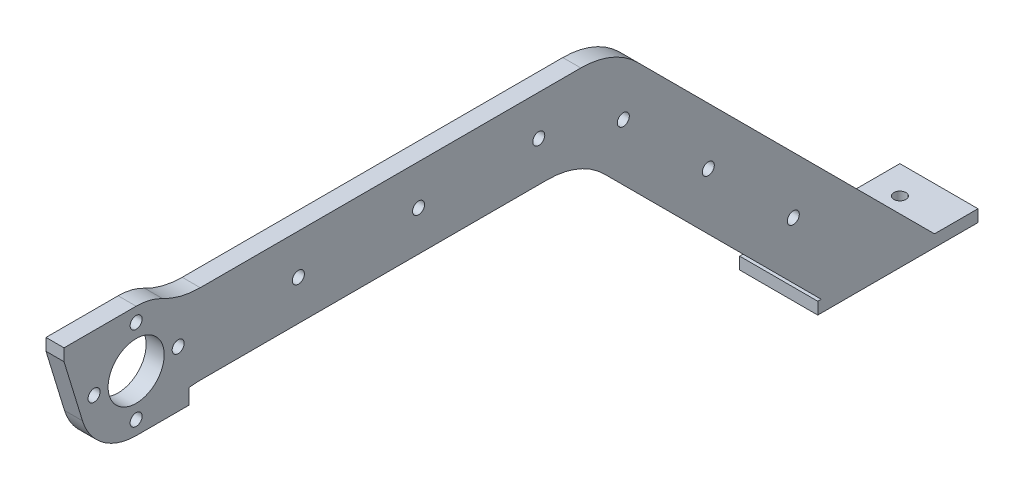
ISO-10303-21;
HEADER;
FILE_DESCRIPTION(('STEP AP214'),'2;1');
FILE_NAME('part.step','',(''),(''),'','','');
FILE_SCHEMA(('AUTOMOTIVE_DESIGN { 1 0 10303 214 1 1 1 1 }'));
ENDSEC;
DATA;
#1=APPLICATION_CONTEXT('core data for automotive mechanical design processes');
#2=APPLICATION_PROTOCOL_DEFINITION('international standard','automotive_design',2000,#1);
#3=PRODUCT_CONTEXT('',#1,'mechanical');
#4=PRODUCT('Part','Part','',(#3));
#5=PRODUCT_RELATED_PRODUCT_CATEGORY('part','',(#4));
#6=PRODUCT_DEFINITION_FORMATION('','',#4);
#7=PRODUCT_DEFINITION_CONTEXT('part definition',#1,'design');
#8=PRODUCT_DEFINITION('design','',#6,#7);
#9=PRODUCT_DEFINITION_SHAPE('','',#8);
#10=(LENGTH_UNIT() NAMED_UNIT(*) SI_UNIT(.MILLI.,.METRE.));
#11=(NAMED_UNIT(*) PLANE_ANGLE_UNIT() SI_UNIT($,.RADIAN.));
#12=(NAMED_UNIT(*) SI_UNIT($,.STERADIAN.) SOLID_ANGLE_UNIT());
#13=UNCERTAINTY_MEASURE_WITH_UNIT(LENGTH_MEASURE(1.E-05),#10,'distance_accuracy_value','');
#14=(GEOMETRIC_REPRESENTATION_CONTEXT(3) GLOBAL_UNCERTAINTY_ASSIGNED_CONTEXT((#13)) GLOBAL_UNIT_ASSIGNED_CONTEXT((#10,
#11,#12)) REPRESENTATION_CONTEXT('',''));
#15=CARTESIAN_POINT('',(0.,0.,0.));
#16=DIRECTION('',(0.,0.,1.));
#17=DIRECTION('',(1.,0.,0.));
#18=AXIS2_PLACEMENT_3D('',#15,#16,#17);
#19=CARTESIAN_POINT('',(2.25,-30.,-16.));
#20=DIRECTION('',(-1.,0.,0.));
#21=DIRECTION('',(0.,0.,1.));
#22=AXIS2_PLACEMENT_3D('',#19,#20,#21);
#23=CYLINDRICAL_SURFACE('',#22,20.);
#24=CARTESIAN_POINT('',(-2.25,-30.,-16.));
#25=DIRECTION('',(1.,0.,0.));
#26=DIRECTION('',(0.,0.,-1.));
#27=AXIS2_PLACEMENT_3D('',#24,#25,#26);
#28=CIRCLE('',#27,20.);
#29=CARTESIAN_POINT('',(-2.25,-10.,-16.));
#30=VERTEX_POINT('',#29);
#31=CARTESIAN_POINT('',(-2.25,-10.1935572336007,-13.2242433569657));
#32=VERTEX_POINT('',#31);
#33=EDGE_CURVE('E234',#30,#32,#28,.T.);
#34=ORIENTED_EDGE('',*,*,#33,.F.);
#35=DIRECTION('',(-1.,0.,0.));
#36=VECTOR('',#35,1.);
#37=CARTESIAN_POINT('',(2.25,-10.,-16.));
#38=LINE('',#37,#36);
#39=CARTESIAN_POINT('',(2.25,-10.,-16.));
#40=VERTEX_POINT('',#39);
#41=EDGE_CURVE('E11',#40,#30,#38,.T.);
#42=ORIENTED_EDGE('',*,*,#41,.F.);
#43=CARTESIAN_POINT('',(2.25,-30.,-16.));
#44=DIRECTION('',(1.,0.,0.));
#45=DIRECTION('',(0.,0.,-1.));
#46=AXIS2_PLACEMENT_3D('',#43,#44,#45);
#47=CIRCLE('',#46,20.);
#48=CARTESIAN_POINT('',(2.25,-10.1935572336007,-13.2242433569657));
#49=VERTEX_POINT('',#48);
#50=EDGE_CURVE('E326',#40,#49,#47,.T.);
#51=ORIENTED_EDGE('',*,*,#50,.T.);
#52=DIRECTION('',(-1.,0.,0.));
#53=VECTOR('',#52,1.);
#54=CARTESIAN_POINT('',(2.25,-10.1935572336007,-13.2242433569657));
#55=LINE('',#54,#53);
#56=EDGE_CURVE('E115',#49,#32,#55,.T.);
#57=ORIENTED_EDGE('',*,*,#56,.T.);
#58=EDGE_LOOP('',(#34,#42,#51,#57));
#59=FACE_BOUND('',#58,.T.);
#60=ADVANCED_FACE('F41',(#59),#23,.F.);
#61=CARTESIAN_POINT('',(2.25,-10.,0.));
#62=DIRECTION('',(0.,1.,0.));
#63=DIRECTION('',(0.,0.,1.));
#64=AXIS2_PLACEMENT_3D('',#61,#62,#63);
#65=PLANE('',#64);
#66=DIRECTION('',(0.,0.,-1.));
#67=VECTOR('',#66,1.);
#68=CARTESIAN_POINT('',(-2.25,-10.,0.));
#69=LINE('',#68,#67);
#70=CARTESIAN_POINT('',(-2.25,-10.,-102.736907966864));
#71=VERTEX_POINT('',#70);
#72=EDGE_CURVE('E238',#30,#71,#69,.T.);
#73=ORIENTED_EDGE('',*,*,#72,.T.);
#74=DIRECTION('',(-1.,0.,0.));
#75=VECTOR('',#74,1.);
#76=CARTESIAN_POINT('',(2.25,-10.,-102.736907966864));
#77=LINE('',#76,#75);
#78=CARTESIAN_POINT('',(2.25,-10.,-102.736907966864));
#79=VERTEX_POINT('',#78);
#80=EDGE_CURVE('E50',#79,#71,#77,.T.);
#81=ORIENTED_EDGE('',*,*,#80,.F.);
#82=DIRECTION('',(0.,0.,-1.));
#83=VECTOR('',#82,1.);
#84=CARTESIAN_POINT('',(2.25,-10.,0.));
#85=LINE('',#84,#83);
#86=EDGE_CURVE('E447',#40,#79,#85,.T.);
#87=ORIENTED_EDGE('',*,*,#86,.F.);
#88=ORIENTED_EDGE('',*,*,#41,.T.);
#89=EDGE_LOOP('',(#73,#81,#87,#88));
#90=FACE_BOUND('',#89,.T.);
#91=ADVANCED_FACE('F537',(#90),#65,.F.);
#92=CARTESIAN_POINT('',(2.25,-29.999988774128,-102.715717526666));
#93=DIRECTION('',(-1.,0.,0.));
#94=DIRECTION('',(0.,0.,1.));
#95=AXIS2_PLACEMENT_3D('',#92,#93,#94);
#96=CYLINDRICAL_SURFACE('',#95,20.);
#97=CARTESIAN_POINT('',(-2.25,-29.999988774128,-102.715717526666));
#98=DIRECTION('',(1.,0.,0.));
#99=DIRECTION('',(0.,0.,-1.));
#100=AXIS2_PLACEMENT_3D('',#97,#98,#99);
#101=CIRCLE('',#100,20.);
#102=CARTESIAN_POINT('',(-2.25,-15.857853150397,-116.857853150397));
#103=VERTEX_POINT('',#102);
#104=EDGE_CURVE('E242',#71,#103,#101,.F.);
#105=ORIENTED_EDGE('',*,*,#104,.T.);
#106=DIRECTION('',(-1.,0.,0.));
#107=VECTOR('',#106,1.);
#108=CARTESIAN_POINT('',(2.25,-15.857853150397,-116.857853150397));
#109=LINE('',#108,#107);
#110=CARTESIAN_POINT('',(2.25,-15.857853150397,-116.857853150397));
#111=VERTEX_POINT('',#110);
#112=EDGE_CURVE('E368',#111,#103,#109,.T.);
#113=ORIENTED_EDGE('',*,*,#112,.F.);
#114=CARTESIAN_POINT('',(2.25,-29.999988774128,-102.715717526666));
#115=DIRECTION('',(1.,0.,0.));
#116=DIRECTION('',(0.,0.,-1.));
#117=AXIS2_PLACEMENT_3D('',#114,#115,#116);
#118=CIRCLE('',#117,20.);
#119=EDGE_CURVE('E379',#79,#111,#118,.F.);
#120=ORIENTED_EDGE('',*,*,#119,.F.);
#121=ORIENTED_EDGE('',*,*,#80,.T.);
#122=EDGE_LOOP('',(#105,#113,#120,#121));
#123=FACE_BOUND('',#122,.T.);
#124=ADVANCED_FACE('F377',(#123),#96,.F.);
#125=CARTESIAN_POINT('',(2.25,50.5000000000001,-50.5000000000003));
#126=DIRECTION('',(0.,0.707106781186546,-0.707106781186549));
#127=DIRECTION('',(0.,0.707106781186549,0.707106781186546));
#128=AXIS2_PLACEMENT_3D('',#125,#126,#127);
#129=PLANE('',#128);
#130=DIRECTION('',(0.,-0.707106781186549,-0.707106781186546));
#131=VECTOR('',#130,1.);
#132=CARTESIAN_POINT('',(-2.25,50.5000000000001,-50.5000000000003));
#133=LINE('',#132,#131);
#134=CARTESIAN_POINT('',(-2.25,-70.,-171.));
#135=VERTEX_POINT('',#134);
#136=EDGE_CURVE('E245',#103,#135,#133,.T.);
#137=ORIENTED_EDGE('',*,*,#136,.T.);
#138=DIRECTION('',(-1.,0.,0.));
#139=VECTOR('',#138,1.);
#140=CARTESIAN_POINT('',(2.25,-70.,-171.));
#141=LINE('',#140,#139);
#142=CARTESIAN_POINT('',(2.25,-70.,-171.));
#143=VERTEX_POINT('',#142);
#144=EDGE_CURVE('E364',#143,#135,#141,.T.);
#145=ORIENTED_EDGE('',*,*,#144,.F.);
#146=DIRECTION('',(0.,-0.707106781186549,-0.707106781186546));
#147=VECTOR('',#146,1.);
#148=CARTESIAN_POINT('',(2.25,50.5000000000001,-50.5000000000003));
#149=LINE('',#148,#147);
#150=EDGE_CURVE('E452',#111,#143,#149,.T.);
#151=ORIENTED_EDGE('',*,*,#150,.F.);
#152=ORIENTED_EDGE('',*,*,#112,.T.);
#153=EDGE_LOOP('',(#137,#145,#151,#152));
#154=FACE_BOUND('',#153,.T.);
#155=ADVANCED_FACE('F390',(#154),#129,.F.);
#156=CARTESIAN_POINT('',(2.25,64.642135623731,-64.6421356237312));
#157=DIRECTION('',(0.,-0.707106781186546,0.707106781186548));
#158=DIRECTION('',(0.,-0.707106781186549,-0.707106781186546));
#159=AXIS2_PLACEMENT_3D('',#156,#157,#158);
#160=PLANE('',#159);
#161=DIRECTION('',(0.,0.707106781186549,0.707106781186546));
#162=VECTOR('',#161,1.);
#163=CARTESIAN_POINT('',(-2.25,64.642135623731,-64.6421356237312));
#164=LINE('',#163,#162);
#165=CARTESIAN_POINT('',(-2.25,-70.,-199.284271247462));
#166=VERTEX_POINT('',#165);
#167=CARTESIAN_POINT('',(-2.25,4.14213562373093,-125.142135623731));
#168=VERTEX_POINT('',#167);
#169=EDGE_CURVE('E253',#166,#168,#164,.T.);
#170=ORIENTED_EDGE('',*,*,#169,.T.);
#171=DIRECTION('',(-1.,0.,0.));
#172=VECTOR('',#171,1.);
#173=CARTESIAN_POINT('',(2.25,4.14213562373093,-125.142135623731));
#174=LINE('',#173,#172);
#175=CARTESIAN_POINT('',(2.25,4.14213562373093,-125.142135623731));
#176=VERTEX_POINT('',#175);
#177=EDGE_CURVE('E357',#176,#168,#174,.T.);
#178=ORIENTED_EDGE('',*,*,#177,.F.);
#179=DIRECTION('',(0.,0.707106781186549,0.707106781186546));
#180=VECTOR('',#179,1.);
#181=CARTESIAN_POINT('',(2.25,64.642135623731,-64.6421356237312));
#182=LINE('',#181,#180);
#183=CARTESIAN_POINT('',(2.25,-70.,-199.284271247462));
#184=VERTEX_POINT('',#183);
#185=EDGE_CURVE('E455',#184,#176,#182,.T.);
#186=ORIENTED_EDGE('',*,*,#185,.F.);
#187=DIRECTION('',(-1.,0.,0.));
#188=VECTOR('',#187,1.);
#189=CARTESIAN_POINT('',(2.25,-70.,-199.284271247462));
#190=LINE('',#189,#188);
#191=EDGE_CURVE('E361',#184,#166,#190,.T.);
#192=ORIENTED_EDGE('',*,*,#191,.T.);
#193=EDGE_LOOP('',(#170,#178,#186,#192));
#194=FACE_BOUND('',#193,.T.);
#195=ADVANCED_FACE('F583',(#194),#160,.F.);
#196=CARTESIAN_POINT('',(2.25,-10.,-111.));
#197=DIRECTION('',(-1.,0.,0.));
#198=DIRECTION('',(0.,0.,1.));
#199=AXIS2_PLACEMENT_3D('',#196,#197,#198);
#200=CYLINDRICAL_SURFACE('',#199,20.);
#201=CARTESIAN_POINT('',(-2.25,-10.,-111.));
#202=DIRECTION('',(1.,0.,0.));
#203=DIRECTION('',(0.,0.,-1.));
#204=AXIS2_PLACEMENT_3D('',#201,#202,#203);
#205=CIRCLE('',#204,20.);
#206=CARTESIAN_POINT('',(-2.25,10.,-111.));
#207=VERTEX_POINT('',#206);
#208=EDGE_CURVE('E256',#168,#207,#205,.T.);
#209=ORIENTED_EDGE('',*,*,#208,.T.);
#210=DIRECTION('',(-1.,0.,0.));
#211=VECTOR('',#210,1.);
#212=CARTESIAN_POINT('',(2.25,10.,-111.));
#213=LINE('',#212,#211);
#214=CARTESIAN_POINT('',(2.25,10.,-111.));
#215=VERTEX_POINT('',#214);
#216=EDGE_CURVE('E353',#215,#207,#213,.T.);
#217=ORIENTED_EDGE('',*,*,#216,.F.);
#218=CARTESIAN_POINT('',(2.25,-10.,-111.));
#219=DIRECTION('',(1.,0.,0.));
#220=DIRECTION('',(0.,0.,-1.));
#221=AXIS2_PLACEMENT_3D('',#218,#219,#220);
#222=CIRCLE('',#221,20.);
#223=EDGE_CURVE('E458',#176,#215,#222,.T.);
#224=ORIENTED_EDGE('',*,*,#223,.F.);
#225=ORIENTED_EDGE('',*,*,#177,.T.);
#226=EDGE_LOOP('',(#209,#217,#224,#225));
#227=FACE_BOUND('',#226,.T.);
#228=ADVANCED_FACE('F579',(#227),#200,.T.);
#229=CARTESIAN_POINT('',(2.25,10.,0.));
#230=DIRECTION('',(0.,-1.,0.));
#231=DIRECTION('',(0.,0.,-1.));
#232=AXIS2_PLACEMENT_3D('',#229,#230,#231);
#233=PLANE('',#232);
#234=DIRECTION('',(0.,0.,1.));
#235=VECTOR('',#234,1.);
#236=CARTESIAN_POINT('',(-2.25,10.,0.));
#237=LINE('',#236,#235);
#238=CARTESIAN_POINT('',(-2.25,10.,-16.));
#239=VERTEX_POINT('',#238);
#240=EDGE_CURVE('E259',#207,#239,#237,.T.);
#241=ORIENTED_EDGE('',*,*,#240,.T.);
#242=DIRECTION('',(-1.,0.,0.));
#243=VECTOR('',#242,1.);
#244=CARTESIAN_POINT('',(2.25,10.,-16.));
#245=LINE('',#244,#243);
#246=CARTESIAN_POINT('',(2.25,10.,-16.));
#247=VERTEX_POINT('',#246);
#248=EDGE_CURVE('E349',#247,#239,#245,.T.);
#249=ORIENTED_EDGE('',*,*,#248,.F.);
#250=DIRECTION('',(0.,0.,1.));
#251=VECTOR('',#250,1.);
#252=CARTESIAN_POINT('',(2.25,10.,0.));
#253=LINE('',#252,#251);
#254=EDGE_CURVE('E461',#215,#247,#253,.T.);
#255=ORIENTED_EDGE('',*,*,#254,.F.);
#256=ORIENTED_EDGE('',*,*,#216,.T.);
#257=EDGE_LOOP('',(#241,#249,#255,#256));
#258=FACE_BOUND('',#257,.T.);
#259=ADVANCED_FACE('F575',(#258),#233,.F.);
#260=CARTESIAN_POINT('',(2.25,30.,-16.));
#261=DIRECTION('',(-1.,0.,0.));
#262=DIRECTION('',(0.,0.,1.));
#263=AXIS2_PLACEMENT_3D('',#260,#261,#262);
#264=CYLINDRICAL_SURFACE('',#263,20.);
#265=CARTESIAN_POINT('',(-2.25,30.,-16.));
#266=DIRECTION('',(1.,0.,0.));
#267=DIRECTION('',(0.,0.,-1.));
#268=AXIS2_PLACEMENT_3D('',#265,#266,#267);
#269=CIRCLE('',#268,20.);
#270=CARTESIAN_POINT('',(-2.25,12.3529411764706,-6.58823529411764));
#271=VERTEX_POINT('',#270);
#272=EDGE_CURVE('E262',#239,#271,#269,.F.);
#273=ORIENTED_EDGE('',*,*,#272,.T.);
#274=DIRECTION('',(-1.,0.,0.));
#275=VECTOR('',#274,1.);
#276=CARTESIAN_POINT('',(2.25,12.3529411764706,-6.58823529411764));
#277=LINE('',#276,#275);
#278=CARTESIAN_POINT('',(2.25,12.3529411764706,-6.58823529411764));
#279=VERTEX_POINT('',#278);
#280=EDGE_CURVE('E345',#279,#271,#277,.T.);
#281=ORIENTED_EDGE('',*,*,#280,.F.);
#282=CARTESIAN_POINT('',(2.25,30.,-16.));
#283=DIRECTION('',(1.,0.,0.));
#284=DIRECTION('',(0.,0.,-1.));
#285=AXIS2_PLACEMENT_3D('',#282,#283,#284);
#286=CIRCLE('',#285,20.);
#287=EDGE_CURVE('E464',#247,#279,#286,.F.);
#288=ORIENTED_EDGE('',*,*,#287,.F.);
#289=ORIENTED_EDGE('',*,*,#248,.T.);
#290=EDGE_LOOP('',(#273,#281,#288,#289));
#291=FACE_BOUND('',#290,.T.);
#292=ADVANCED_FACE('F572',(#291),#264,.F.);
#293=CARTESIAN_POINT('',(2.25,0.,0.));
#294=DIRECTION('',(-1.,0.,0.));
#295=DIRECTION('',(0.,0.,1.));
#296=AXIS2_PLACEMENT_3D('',#293,#294,#295);
#297=CYLINDRICAL_SURFACE('',#296,14.);
#298=CARTESIAN_POINT('',(-2.25,0.,0.));
#299=DIRECTION('',(1.,0.,0.));
#300=DIRECTION('',(0.,0.,-1.));
#301=AXIS2_PLACEMENT_3D('',#298,#299,#300);
#302=CIRCLE('',#301,14.);
#303=CARTESIAN_POINT('',(-2.25,14.,0.));
#304=VERTEX_POINT('',#303);
#305=EDGE_CURVE('E265',#271,#304,#302,.T.);
#306=ORIENTED_EDGE('',*,*,#305,.T.);
#307=DIRECTION('',(-1.,0.,0.));
#308=VECTOR('',#307,1.);
#309=CARTESIAN_POINT('',(2.25,14.,0.));
#310=LINE('',#309,#308);
#311=CARTESIAN_POINT('',(2.25,14.,0.));
#312=VERTEX_POINT('',#311);
#313=EDGE_CURVE('E341',#312,#304,#310,.T.);
#314=ORIENTED_EDGE('',*,*,#313,.F.);
#315=CARTESIAN_POINT('',(2.25,0.,0.));
#316=DIRECTION('',(1.,0.,0.));
#317=DIRECTION('',(0.,0.,-1.));
#318=AXIS2_PLACEMENT_3D('',#315,#316,#317);
#319=CIRCLE('',#318,14.);
#320=EDGE_CURVE('E173',#279,#312,#319,.T.);
#321=ORIENTED_EDGE('',*,*,#320,.F.);
#322=ORIENTED_EDGE('',*,*,#280,.T.);
#323=EDGE_LOOP('',(#306,#314,#321,#322));
#324=FACE_BOUND('',#323,.T.);
#325=ADVANCED_FACE('F563',(#324),#297,.T.);
#326=CARTESIAN_POINT('',(2.25,14.,0.));
#327=DIRECTION('',(0.,-1.,0.));
#328=DIRECTION('',(0.,0.,-1.));
#329=AXIS2_PLACEMENT_3D('',#326,#327,#328);
#330=PLANE('',#329);
#331=DIRECTION('',(0.,0.,1.));
#332=VECTOR('',#331,1.);
#333=CARTESIAN_POINT('',(-2.25,14.,0.));
#334=LINE('',#333,#332);
#335=CARTESIAN_POINT('',(-2.25,14.,18.));
#336=VERTEX_POINT('',#335);
#337=EDGE_CURVE('E268',#304,#336,#334,.T.);
#338=ORIENTED_EDGE('',*,*,#337,.T.);
#339=DIRECTION('',(-1.,0.,0.));
#340=VECTOR('',#339,1.);
#341=CARTESIAN_POINT('',(2.25,14.,18.));
#342=LINE('',#341,#340);
#343=CARTESIAN_POINT('',(2.25,14.,18.));
#344=VERTEX_POINT('',#343);
#345=EDGE_CURVE('E337',#344,#336,#342,.T.);
#346=ORIENTED_EDGE('',*,*,#345,.F.);
#347=DIRECTION('',(0.,0.,1.));
#348=VECTOR('',#347,1.);
#349=CARTESIAN_POINT('',(2.25,14.,0.));
#350=LINE('',#349,#348);
#351=EDGE_CURVE('E468',#312,#344,#350,.T.);
#352=ORIENTED_EDGE('',*,*,#351,.F.);
#353=ORIENTED_EDGE('',*,*,#313,.T.);
#354=EDGE_LOOP('',(#338,#346,#352,#353));
#355=FACE_BOUND('',#354,.T.);
#356=ADVANCED_FACE('F568',(#355),#330,.F.);
#357=CARTESIAN_POINT('',(2.25,0.,18.));
#358=DIRECTION('',(0.,0.,-1.));
#359=DIRECTION('',(0.,1.,0.));
#360=AXIS2_PLACEMENT_3D('',#357,#358,#359);
#361=PLANE('',#360);
#362=DIRECTION('',(0.,-1.,0.));
#363=VECTOR('',#362,1.);
#364=CARTESIAN_POINT('',(-2.25,0.,18.));
#365=LINE('',#364,#363);
#366=CARTESIAN_POINT('',(-2.25,11.,18.));
#367=VERTEX_POINT('',#366);
#368=EDGE_CURVE('E271',#336,#367,#365,.T.);
#369=ORIENTED_EDGE('',*,*,#368,.T.);
#370=DIRECTION('',(-1.,0.,0.));
#371=VECTOR('',#370,1.);
#372=CARTESIAN_POINT('',(2.25,11.,18.));
#373=LINE('',#372,#371);
#374=CARTESIAN_POINT('',(2.25,11.,18.));
#375=VERTEX_POINT('',#374);
#376=EDGE_CURVE('E333',#375,#367,#373,.T.);
#377=ORIENTED_EDGE('',*,*,#376,.F.);
#378=DIRECTION('',(0.,-1.,0.));
#379=VECTOR('',#378,1.);
#380=CARTESIAN_POINT('',(2.25,0.,18.));
#381=LINE('',#380,#379);
#382=EDGE_CURVE('E470',#344,#375,#381,.T.);
#383=ORIENTED_EDGE('',*,*,#382,.F.);
#384=ORIENTED_EDGE('',*,*,#345,.T.);
#385=EDGE_LOOP('',(#369,#377,#383,#384));
#386=FACE_BOUND('',#385,.T.);
#387=ADVANCED_FACE('F478',(#386),#361,.F.);
#388=CARTESIAN_POINT('',(2.25,-4.09099534200223,13.3889415978903));
#389=DIRECTION('',(0.,0.292213953000159,-0.956352971277875));
#390=DIRECTION('',(0.,0.956352971277876,0.292213953000159));
#391=AXIS2_PLACEMENT_3D('',#388,#389,#390);
#392=PLANE('',#391);
#393=DIRECTION('',(0.,-0.956352971277876,-0.292213953000159));
#394=VECTOR('',#393,1.);
#395=CARTESIAN_POINT('',(-2.25,-4.09099534200223,13.3889415978903));
#396=LINE('',#395,#394);
#397=CARTESIAN_POINT('',(-2.25,-4.09099534200223,13.3889415978903));
#398=VERTEX_POINT('',#397);
#399=EDGE_CURVE('E274',#367,#398,#396,.T.);
#400=ORIENTED_EDGE('',*,*,#399,.T.);
#401=DIRECTION('',(-1.,0.,0.));
#402=VECTOR('',#401,1.);
#403=CARTESIAN_POINT('',(2.25,-4.09099534200223,13.3889415978903));
#404=LINE('',#403,#402);
#405=CARTESIAN_POINT('',(2.25,-4.09099534200223,13.3889415978903));
#406=VERTEX_POINT('',#405);
#407=EDGE_CURVE('E179',#406,#398,#404,.T.);
#408=ORIENTED_EDGE('',*,*,#407,.F.);
#409=DIRECTION('',(0.,-0.956352971277876,-0.292213953000159));
#410=VECTOR('',#409,1.);
#411=CARTESIAN_POINT('',(2.25,-4.09099534200223,13.3889415978903));
#412=LINE('',#411,#410);
#413=EDGE_CURVE('E167',#375,#406,#412,.T.);
#414=ORIENTED_EDGE('',*,*,#413,.F.);
#415=ORIENTED_EDGE('',*,*,#376,.T.);
#416=EDGE_LOOP('',(#400,#408,#414,#415));
#417=FACE_BOUND('',#416,.T.);
#418=ADVANCED_FACE('F482',(#417),#392,.F.);
#419=CARTESIAN_POINT('',(-2.25,-14.,-1.46642215033931E-13));
#420=VERTEX_POINT('',#419);
#421=EDGE_CURVE('E177',#398,#420,#302,.T.);
#422=ORIENTED_EDGE('',*,*,#421,.T.);
#423=DIRECTION('',(-1.,0.,0.));
#424=VECTOR('',#423,1.);
#425=CARTESIAN_POINT('',(2.25,-14.,-1.46642215033931E-13));
#426=LINE('',#425,#424);
#427=CARTESIAN_POINT('',(2.25,-14.,-1.46642215033931E-13));
#428=VERTEX_POINT('',#427);
#429=EDGE_CURVE('E174',#428,#420,#426,.T.);
#430=ORIENTED_EDGE('',*,*,#429,.F.);
#431=EDGE_CURVE('E160',#406,#428,#319,.T.);
#432=ORIENTED_EDGE('',*,*,#431,.F.);
#433=ORIENTED_EDGE('',*,*,#407,.T.);
#434=EDGE_LOOP('',(#422,#430,#432,#433));
#435=FACE_BOUND('',#434,.T.);
#436=ADVANCED_FACE('F175',(#435),#297,.T.);
#437=CARTESIAN_POINT('',(2.25,-14.,0.));
#438=DIRECTION('',(0.,1.,0.));
#439=DIRECTION('',(0.,0.,1.));
#440=AXIS2_PLACEMENT_3D('',#437,#438,#439);
#441=PLANE('',#440);
#442=DIRECTION('',(0.,0.,-1.));
#443=VECTOR('',#442,1.);
#444=CARTESIAN_POINT('',(-2.25,-14.,0.));
#445=LINE('',#444,#443);
#446=CARTESIAN_POINT('',(-2.25,-14.,-13.2242433569657));
#447=VERTEX_POINT('',#446);
#448=EDGE_CURVE('E108',#420,#447,#445,.T.);
#449=ORIENTED_EDGE('',*,*,#448,.T.);
#450=DIRECTION('',(-1.,0.,0.));
#451=VECTOR('',#450,1.);
#452=CARTESIAN_POINT('',(2.25,-14.,-13.2242433569657));
#453=LINE('',#452,#451);
#454=CARTESIAN_POINT('',(2.25,-14.,-13.2242433569657));
#455=VERTEX_POINT('',#454);
#456=EDGE_CURVE('E180',#455,#447,#453,.T.);
#457=ORIENTED_EDGE('',*,*,#456,.F.);
#458=DIRECTION('',(0.,0.,-1.));
#459=VECTOR('',#458,1.);
#460=CARTESIAN_POINT('',(2.25,-14.,0.));
#461=LINE('',#460,#459);
#462=EDGE_CURVE('E165',#428,#455,#461,.T.);
#463=ORIENTED_EDGE('',*,*,#462,.F.);
#464=ORIENTED_EDGE('',*,*,#429,.T.);
#465=EDGE_LOOP('',(#449,#457,#463,#464));
#466=FACE_BOUND('',#465,.T.);
#467=ADVANCED_FACE('F182',(#466),#441,.F.);
#468=CARTESIAN_POINT('',(2.25,10.5,0.));
#469=DIRECTION('',(-1.,0.,0.));
#470=DIRECTION('',(0.,0.,1.));
#471=AXIS2_PLACEMENT_3D('',#468,#469,#470);
#472=CYLINDRICAL_SURFACE('',#471,1.5);
#473=CARTESIAN_POINT('',(2.25,10.5,0.));
#474=DIRECTION('',(1.,0.,0.));
#475=DIRECTION('',(0.,0.,-1.));
#476=AXIS2_PLACEMENT_3D('',#473,#474,#475);
#477=CIRCLE('',#476,1.5);
#478=CARTESIAN_POINT('',(2.25,10.5,-1.5));
#479=VERTEX_POINT('',#478);
#480=EDGE_CURVE('E226',#479,#479,#477,.T.);
#481=ORIENTED_EDGE('',*,*,#480,.T.);
#482=EDGE_LOOP('',(#481));
#483=FACE_BOUND('',#482,.T.);
#484=CARTESIAN_POINT('',(-2.25,10.5,0.));
#485=DIRECTION('',(1.,0.,0.));
#486=DIRECTION('',(0.,0.,-1.));
#487=AXIS2_PLACEMENT_3D('',#484,#485,#486);
#488=CIRCLE('',#487,1.5);
#489=CARTESIAN_POINT('',(-2.25,10.5,-1.5));
#490=VERTEX_POINT('',#489);
#491=EDGE_CURVE('E318',#490,#490,#488,.T.);
#492=ORIENTED_EDGE('',*,*,#491,.F.);
#493=EDGE_LOOP('',(#492));
#494=FACE_BOUND('',#493,.T.);
#495=ADVANCED_FACE('F560',(#483,#494),#472,.F.);
#496=CARTESIAN_POINT('',(2.25,0.,-10.5));
#497=DIRECTION('',(-1.,0.,0.));
#498=DIRECTION('',(0.,0.,1.));
#499=AXIS2_PLACEMENT_3D('',#496,#497,#498);
#500=CYLINDRICAL_SURFACE('',#499,1.50000000000003);
#501=CARTESIAN_POINT('',(2.25,0.,-10.5));
#502=DIRECTION('',(1.,0.,0.));
#503=DIRECTION('',(0.,0.,-1.));
#504=AXIS2_PLACEMENT_3D('',#501,#502,#503);
#505=CIRCLE('',#504,1.50000000000003);
#506=CARTESIAN_POINT('',(2.25,0.,-12.));
#507=VERTEX_POINT('',#506);
#508=EDGE_CURVE('E222',#507,#507,#505,.T.);
#509=ORIENTED_EDGE('',*,*,#508,.T.);
#510=EDGE_LOOP('',(#509));
#511=FACE_BOUND('',#510,.T.);
#512=CARTESIAN_POINT('',(-2.25,0.,-10.5));
#513=DIRECTION('',(1.,0.,0.));
#514=DIRECTION('',(0.,0.,-1.));
#515=AXIS2_PLACEMENT_3D('',#512,#513,#514);
#516=CIRCLE('',#515,1.50000000000003);
#517=CARTESIAN_POINT('',(-2.25,0.,-12.));
#518=VERTEX_POINT('',#517);
#519=EDGE_CURVE('E314',#518,#518,#516,.T.);
#520=ORIENTED_EDGE('',*,*,#519,.F.);
#521=EDGE_LOOP('',(#520));
#522=FACE_BOUND('',#521,.T.);
#523=ADVANCED_FACE('F649',(#511,#522),#500,.F.);
#524=CARTESIAN_POINT('',(2.25,-10.5,0.));
#525=DIRECTION('',(-1.,0.,0.));
#526=DIRECTION('',(0.,0.,1.));
#527=AXIS2_PLACEMENT_3D('',#524,#525,#526);
#528=CYLINDRICAL_SURFACE('',#527,1.50000000000007);
#529=CARTESIAN_POINT('',(2.25,-10.5,0.));
#530=DIRECTION('',(1.,0.,0.));
#531=DIRECTION('',(0.,0.,-1.));
#532=AXIS2_PLACEMENT_3D('',#529,#530,#531);
#533=CIRCLE('',#532,1.50000000000007);
#534=CARTESIAN_POINT('',(2.25,-10.5,-1.50000000000007));
#535=VERTEX_POINT('',#534);
#536=EDGE_CURVE('E218',#535,#535,#533,.T.);
#537=ORIENTED_EDGE('',*,*,#536,.T.);
#538=EDGE_LOOP('',(#537));
#539=FACE_BOUND('',#538,.T.);
#540=CARTESIAN_POINT('',(-2.25,-10.5,0.));
#541=DIRECTION('',(1.,0.,0.));
#542=DIRECTION('',(0.,0.,-1.));
#543=AXIS2_PLACEMENT_3D('',#540,#541,#542);
#544=CIRCLE('',#543,1.50000000000007);
#545=CARTESIAN_POINT('',(-2.25,-10.5,-1.50000000000007));
#546=VERTEX_POINT('',#545);
#547=EDGE_CURVE('E310',#546,#546,#544,.T.);
#548=ORIENTED_EDGE('',*,*,#547,.F.);
#549=EDGE_LOOP('',(#548));
#550=FACE_BOUND('',#549,.T.);
#551=ADVANCED_FACE('F657',(#539,#550),#528,.F.);
#552=CARTESIAN_POINT('',(2.25,0.,10.5));
#553=DIRECTION('',(-1.,0.,0.));
#554=DIRECTION('',(0.,0.,1.));
#555=AXIS2_PLACEMENT_3D('',#552,#553,#554);
#556=CYLINDRICAL_SURFACE('',#555,1.5000000000001);
#557=CARTESIAN_POINT('',(2.25,0.,10.5));
#558=DIRECTION('',(1.,0.,0.));
#559=DIRECTION('',(0.,0.,-1.));
#560=AXIS2_PLACEMENT_3D('',#557,#558,#559);
#561=CIRCLE('',#560,1.5000000000001);
#562=CARTESIAN_POINT('',(2.25,0.,8.9999999999999));
#563=VERTEX_POINT('',#562);
#564=EDGE_CURVE('E214',#563,#563,#561,.T.);
#565=ORIENTED_EDGE('',*,*,#564,.T.);
#566=EDGE_LOOP('',(#565));
#567=FACE_BOUND('',#566,.T.);
#568=CARTESIAN_POINT('',(-2.25,0.,10.5));
#569=DIRECTION('',(1.,0.,0.));
#570=DIRECTION('',(0.,0.,-1.));
#571=AXIS2_PLACEMENT_3D('',#568,#569,#570);
#572=CIRCLE('',#571,1.5000000000001);
#573=CARTESIAN_POINT('',(-2.25,0.,8.9999999999999));
#574=VERTEX_POINT('',#573);
#575=EDGE_CURVE('E306',#574,#574,#572,.T.);
#576=ORIENTED_EDGE('',*,*,#575,.F.);
#577=EDGE_LOOP('',(#576));
#578=FACE_BOUND('',#577,.T.);
#579=ADVANCED_FACE('F665',(#567,#578),#556,.F.);
#580=CARTESIAN_POINT('',(2.25,0.,-40.5));
#581=DIRECTION('',(-1.,0.,0.));
#582=DIRECTION('',(0.,0.,1.));
#583=AXIS2_PLACEMENT_3D('',#580,#581,#582);
#584=CYLINDRICAL_SURFACE('',#583,1.5);
#585=CARTESIAN_POINT('',(2.25,0.,-40.5));
#586=DIRECTION('',(1.,0.,0.));
#587=DIRECTION('',(0.,0.,-1.));
#588=AXIS2_PLACEMENT_3D('',#585,#586,#587);
#589=CIRCLE('',#588,1.5);
#590=CARTESIAN_POINT('',(2.25,0.,-42.));
#591=VERTEX_POINT('',#590);
#592=EDGE_CURVE('E210',#591,#591,#589,.T.);
#593=ORIENTED_EDGE('',*,*,#592,.T.);
#594=EDGE_LOOP('',(#593));
#595=FACE_BOUND('',#594,.T.);
#596=CARTESIAN_POINT('',(-2.25,0.,-40.5));
#597=DIRECTION('',(1.,0.,0.));
#598=DIRECTION('',(0.,0.,-1.));
#599=AXIS2_PLACEMENT_3D('',#596,#597,#598);
#600=CIRCLE('',#599,1.5);
#601=CARTESIAN_POINT('',(-2.25,0.,-42.));
#602=VERTEX_POINT('',#601);
#603=EDGE_CURVE('E302',#602,#602,#600,.T.);
#604=ORIENTED_EDGE('',*,*,#603,.F.);
#605=EDGE_LOOP('',(#604));
#606=FACE_BOUND('',#605,.T.);
#607=ADVANCED_FACE('F673',(#595,#606),#584,.F.);
#608=CARTESIAN_POINT('',(2.25,0.,-70.5));
#609=DIRECTION('',(-1.,0.,0.));
#610=DIRECTION('',(0.,0.,1.));
#611=AXIS2_PLACEMENT_3D('',#608,#609,#610);
#612=CYLINDRICAL_SURFACE('',#611,1.5);
#613=CARTESIAN_POINT('',(2.25,0.,-70.5));
#614=DIRECTION('',(1.,0.,0.));
#615=DIRECTION('',(0.,0.,-1.));
#616=AXIS2_PLACEMENT_3D('',#613,#614,#615);
#617=CIRCLE('',#616,1.5);
#618=CARTESIAN_POINT('',(2.25,0.,-72.));
#619=VERTEX_POINT('',#618);
#620=EDGE_CURVE('E206',#619,#619,#617,.T.);
#621=ORIENTED_EDGE('',*,*,#620,.T.);
#622=EDGE_LOOP('',(#621));
#623=FACE_BOUND('',#622,.T.);
#624=CARTESIAN_POINT('',(-2.25,0.,-70.5));
#625=DIRECTION('',(1.,0.,0.));
#626=DIRECTION('',(0.,0.,-1.));
#627=AXIS2_PLACEMENT_3D('',#624,#625,#626);
#628=CIRCLE('',#627,1.5);
#629=CARTESIAN_POINT('',(-2.25,0.,-72.));
#630=VERTEX_POINT('',#629);
#631=EDGE_CURVE('E298',#630,#630,#628,.T.);
#632=ORIENTED_EDGE('',*,*,#631,.F.);
#633=EDGE_LOOP('',(#632));
#634=FACE_BOUND('',#633,.T.);
#635=ADVANCED_FACE('F681',(#623,#634),#612,.F.);
#636=CARTESIAN_POINT('',(2.25,0.,-100.5));
#637=DIRECTION('',(-1.,0.,0.));
#638=DIRECTION('',(0.,0.,1.));
#639=AXIS2_PLACEMENT_3D('',#636,#637,#638);
#640=CYLINDRICAL_SURFACE('',#639,1.5);
#641=CARTESIAN_POINT('',(2.25,0.,-100.5));
#642=DIRECTION('',(1.,0.,0.));
#643=DIRECTION('',(0.,0.,-1.));
#644=AXIS2_PLACEMENT_3D('',#641,#642,#643);
#645=CIRCLE('',#644,1.5);
#646=CARTESIAN_POINT('',(2.25,0.,-102.));
#647=VERTEX_POINT('',#646);
#648=EDGE_CURVE('E202',#647,#647,#645,.T.);
#649=ORIENTED_EDGE('',*,*,#648,.T.);
#650=EDGE_LOOP('',(#649));
#651=FACE_BOUND('',#650,.T.);
#652=CARTESIAN_POINT('',(-2.25,0.,-100.5));
#653=DIRECTION('',(1.,0.,0.));
#654=DIRECTION('',(0.,0.,-1.));
#655=AXIS2_PLACEMENT_3D('',#652,#653,#654);
#656=CIRCLE('',#655,1.5);
#657=CARTESIAN_POINT('',(-2.25,0.,-102.));
#658=VERTEX_POINT('',#657);
#659=EDGE_CURVE('E294',#658,#658,#656,.T.);
#660=ORIENTED_EDGE('',*,*,#659,.F.);
#661=EDGE_LOOP('',(#660));
#662=FACE_BOUND('',#661,.T.);
#663=ADVANCED_FACE('F689',(#651,#662),#640,.F.);
#664=CARTESIAN_POINT('',(2.25,-6.4678643762689,-121.61));
#665=DIRECTION('',(-1.,0.,0.));
#666=DIRECTION('',(0.,0.,1.));
#667=AXIS2_PLACEMENT_3D('',#664,#665,#666);
#668=CYLINDRICAL_SURFACE('',#667,1.49999999999997);
#669=CARTESIAN_POINT('',(2.25,-6.4678643762689,-121.61));
#670=DIRECTION('',(1.,0.,0.));
#671=DIRECTION('',(0.,0.,-1.));
#672=AXIS2_PLACEMENT_3D('',#669,#670,#671);
#673=CIRCLE('',#672,1.49999999999997);
#674=CARTESIAN_POINT('',(2.25,-6.4678643762689,-123.11));
#675=VERTEX_POINT('',#674);
#676=EDGE_CURVE('E198',#675,#675,#673,.T.);
#677=ORIENTED_EDGE('',*,*,#676,.T.);
#678=EDGE_LOOP('',(#677));
#679=FACE_BOUND('',#678,.T.);
#680=CARTESIAN_POINT('',(-2.25,-6.4678643762689,-121.61));
#681=DIRECTION('',(1.,0.,0.));
#682=DIRECTION('',(0.,0.,-1.));
#683=AXIS2_PLACEMENT_3D('',#680,#681,#682);
#684=CIRCLE('',#683,1.49999999999997);
#685=CARTESIAN_POINT('',(-2.25,-6.4678643762689,-123.11));
#686=VERTEX_POINT('',#685);
#687=EDGE_CURVE('E290',#686,#686,#684,.T.);
#688=ORIENTED_EDGE('',*,*,#687,.F.);
#689=EDGE_LOOP('',(#688));
#690=FACE_BOUND('',#689,.T.);
#691=ADVANCED_FACE('F697',(#679,#690),#668,.F.);
#692=CARTESIAN_POINT('',(2.25,-27.6810678118654,-142.823203435596));
#693=DIRECTION('',(-1.,0.,0.));
#694=DIRECTION('',(0.,0.,1.));
#695=AXIS2_PLACEMENT_3D('',#692,#693,#694);
#696=CYLINDRICAL_SURFACE('',#695,1.49999999999997);
#697=CARTESIAN_POINT('',(2.25,-27.6810678118654,-142.823203435596));
#698=DIRECTION('',(1.,0.,0.));
#699=DIRECTION('',(0.,0.,-1.));
#700=AXIS2_PLACEMENT_3D('',#697,#698,#699);
#701=CIRCLE('',#700,1.49999999999997);
#702=CARTESIAN_POINT('',(2.25,-27.6810678118654,-144.323203435596));
#703=VERTEX_POINT('',#702);
#704=EDGE_CURVE('E194',#703,#703,#701,.T.);
#705=ORIENTED_EDGE('',*,*,#704,.T.);
#706=EDGE_LOOP('',(#705));
#707=FACE_BOUND('',#706,.T.);
#708=CARTESIAN_POINT('',(-2.25,-27.6810678118654,-142.823203435596));
#709=DIRECTION('',(1.,0.,0.));
#710=DIRECTION('',(0.,0.,-1.));
#711=AXIS2_PLACEMENT_3D('',#708,#709,#710);
#712=CIRCLE('',#711,1.49999999999997);
#713=CARTESIAN_POINT('',(-2.25,-27.6810678118654,-144.323203435596));
#714=VERTEX_POINT('',#713);
#715=EDGE_CURVE('E286',#714,#714,#712,.T.);
#716=ORIENTED_EDGE('',*,*,#715,.F.);
#717=EDGE_LOOP('',(#716));
#718=FACE_BOUND('',#717,.T.);
#719=ADVANCED_FACE('F553',(#707,#718),#696,.F.);
#720=CARTESIAN_POINT('',(2.25,-48.8942712474618,-164.036406871193));
#721=DIRECTION('',(-1.,0.,0.));
#722=DIRECTION('',(0.,0.,1.));
#723=AXIS2_PLACEMENT_3D('',#720,#721,#722);
#724=CYLINDRICAL_SURFACE('',#723,1.5);
#725=CARTESIAN_POINT('',(2.25,-48.8942712474618,-164.036406871193));
#726=DIRECTION('',(1.,0.,0.));
#727=DIRECTION('',(0.,0.,-1.));
#728=AXIS2_PLACEMENT_3D('',#725,#726,#727);
#729=CIRCLE('',#728,1.5);
#730=CARTESIAN_POINT('',(2.25,-48.8942712474618,-165.536406871193));
#731=VERTEX_POINT('',#730);
#732=EDGE_CURVE('E186',#731,#731,#729,.T.);
#733=ORIENTED_EDGE('',*,*,#732,.T.);
#734=EDGE_LOOP('',(#733));
#735=FACE_BOUND('',#734,.T.);
#736=CARTESIAN_POINT('',(-2.25,-48.8942712474618,-164.036406871193));
#737=DIRECTION('',(1.,0.,0.));
#738=DIRECTION('',(0.,0.,-1.));
#739=AXIS2_PLACEMENT_3D('',#736,#737,#738);
#740=CIRCLE('',#739,1.5);
#741=CARTESIAN_POINT('',(-2.25,-48.8942712474618,-165.536406871193));
#742=VERTEX_POINT('',#741);
#743=EDGE_CURVE('E282',#742,#742,#740,.T.);
#744=ORIENTED_EDGE('',*,*,#743,.F.);
#745=EDGE_LOOP('',(#744));
#746=FACE_BOUND('',#745,.T.);
#747=ADVANCED_FACE('F545',(#735,#746),#724,.F.);
#748=CARTESIAN_POINT('',(2.25,0.,-13.2242433569657));
#749=DIRECTION('',(0.,0.,1.));
#750=DIRECTION('',(1.,0.,0.));
#751=AXIS2_PLACEMENT_3D('',#748,#749,#750);
#752=PLANE('',#751);
#753=DIRECTION('',(0.,1.,0.));
#754=VECTOR('',#753,1.);
#755=CARTESIAN_POINT('',(-2.25,0.,-13.2242433569657));
#756=LINE('',#755,#754);
#757=EDGE_CURVE('E279',#447,#32,#756,.T.);
#758=ORIENTED_EDGE('',*,*,#757,.T.);
#759=ORIENTED_EDGE('',*,*,#56,.F.);
#760=DIRECTION('',(0.,1.,0.));
#761=VECTOR('',#760,1.);
#762=CARTESIAN_POINT('',(2.25,0.,-13.2242433569657));
#763=LINE('',#762,#761);
#764=EDGE_CURVE('E58',#455,#49,#763,.T.);
#765=ORIENTED_EDGE('',*,*,#764,.F.);
#766=ORIENTED_EDGE('',*,*,#456,.T.);
#767=EDGE_LOOP('',(#758,#759,#765,#766));
#768=FACE_BOUND('',#767,.T.);
#769=ADVANCED_FACE('F542',(#768),#752,.F.);
#770=CARTESIAN_POINT('',(2.25,0.,0.));
#771=DIRECTION('',(-1.,0.,0.));
#772=DIRECTION('',(0.,0.,1.));
#773=AXIS2_PLACEMENT_3D('',#770,#771,#772);
#774=CYLINDRICAL_SURFACE('',#773,7.);
#775=CARTESIAN_POINT('',(2.25,0.,0.));
#776=DIRECTION('',(1.,0.,0.));
#777=DIRECTION('',(0.,0.,-1.));
#778=AXIS2_PLACEMENT_3D('',#775,#776,#777);
#779=CIRCLE('',#778,7.);
#780=CARTESIAN_POINT('',(2.25,0.,-7.));
#781=VERTEX_POINT('',#780);
#782=EDGE_CURVE('E230',#781,#781,#779,.T.);
#783=ORIENTED_EDGE('',*,*,#782,.T.);
#784=EDGE_LOOP('',(#783));
#785=FACE_BOUND('',#784,.T.);
#786=CARTESIAN_POINT('',(-2.25,0.,0.));
#787=DIRECTION('',(1.,0.,0.));
#788=DIRECTION('',(0.,0.,-1.));
#789=AXIS2_PLACEMENT_3D('',#786,#787,#788);
#790=CIRCLE('',#789,7.);
#791=CARTESIAN_POINT('',(-2.25,0.,-7.));
#792=VERTEX_POINT('',#791);
#793=EDGE_CURVE('E322',#792,#792,#790,.T.);
#794=ORIENTED_EDGE('',*,*,#793,.F.);
#795=EDGE_LOOP('',(#794));
#796=FACE_BOUND('',#795,.T.);
#797=ADVANCED_FACE('F544',(#785,#796),#774,.F.);
#798=CARTESIAN_POINT('',(2.25,0.,0.));
#799=DIRECTION('',(1.,0.,0.));
#800=DIRECTION('',(0.,0.,-1.));
#801=AXIS2_PLACEMENT_3D('',#798,#799,#800);
#802=PLANE('',#801);
#803=ORIENTED_EDGE('',*,*,#50,.F.);
#804=ORIENTED_EDGE('',*,*,#86,.T.);
#805=ORIENTED_EDGE('',*,*,#119,.T.);
#806=ORIENTED_EDGE('',*,*,#150,.T.);
#807=DIRECTION('',(0.,0.,1.));
#808=VECTOR('',#807,1.);
#809=CARTESIAN_POINT('',(2.25,-70.,-170.144271247462));
#810=LINE('',#809,#808);
#811=CARTESIAN_POINT('',(2.25,-70.,-170.144271247462));
#812=VERTEX_POINT('',#811);
#813=EDGE_CURVE('E399',#143,#812,#810,.T.);
#814=ORIENTED_EDGE('',*,*,#813,.T.);
#815=DIRECTION('',(0.,1.,0.));
#816=VECTOR('',#815,1.);
#817=CARTESIAN_POINT('',(2.25,-73.,-170.144271247462));
#818=LINE('',#817,#816);
#819=CARTESIAN_POINT('',(2.25,-73.,-170.144271247462));
#820=VERTEX_POINT('',#819);
#821=EDGE_CURVE('E239',#820,#812,#818,.T.);
#822=ORIENTED_EDGE('',*,*,#821,.F.);
#823=DIRECTION('',(0.,0.,1.));
#824=VECTOR('',#823,1.);
#825=CARTESIAN_POINT('',(2.25,-73.,-170.144271247462));
#826=LINE('',#825,#824);
#827=CARTESIAN_POINT('',(2.25,-73.,-210.144271247462));
#828=VERTEX_POINT('',#827);
#829=EDGE_CURVE('E430',#828,#820,#826,.T.);
#830=ORIENTED_EDGE('',*,*,#829,.F.);
#831=DIRECTION('',(0.,1.,0.));
#832=VECTOR('',#831,1.);
#833=CARTESIAN_POINT('',(2.25,-73.,-210.144271247462));
#834=LINE('',#833,#832);
#835=CARTESIAN_POINT('',(2.25,-70.,-210.144271247462));
#836=VERTEX_POINT('',#835);
#837=EDGE_CURVE('E431',#828,#836,#834,.T.);
#838=ORIENTED_EDGE('',*,*,#837,.T.);
#839=EDGE_CURVE('E407',#836,#184,#810,.T.);
#840=ORIENTED_EDGE('',*,*,#839,.T.);
#841=ORIENTED_EDGE('',*,*,#185,.T.);
#842=ORIENTED_EDGE('',*,*,#223,.T.);
#843=ORIENTED_EDGE('',*,*,#254,.T.);
#844=ORIENTED_EDGE('',*,*,#287,.T.);
#845=ORIENTED_EDGE('',*,*,#320,.T.);
#846=ORIENTED_EDGE('',*,*,#351,.T.);
#847=ORIENTED_EDGE('',*,*,#382,.T.);
#848=ORIENTED_EDGE('',*,*,#413,.T.);
#849=ORIENTED_EDGE('',*,*,#431,.T.);
#850=ORIENTED_EDGE('',*,*,#462,.T.);
#851=ORIENTED_EDGE('',*,*,#764,.T.);
#852=EDGE_LOOP('',(#803,#804,#805,#806,#814,#822,#830,#838,#840,#841,#842,#843,#844,#845,#846,
#847,#848,#849,#850,#851));
#853=FACE_BOUND('',#852,.T.);
#854=ORIENTED_EDGE('',*,*,#732,.F.);
#855=EDGE_LOOP('',(#854));
#856=FACE_BOUND('',#855,.T.);
#857=ORIENTED_EDGE('',*,*,#704,.F.);
#858=EDGE_LOOP('',(#857));
#859=FACE_BOUND('',#858,.T.);
#860=ORIENTED_EDGE('',*,*,#676,.F.);
#861=EDGE_LOOP('',(#860));
#862=FACE_BOUND('',#861,.T.);
#863=ORIENTED_EDGE('',*,*,#648,.F.);
#864=EDGE_LOOP('',(#863));
#865=FACE_BOUND('',#864,.T.);
#866=ORIENTED_EDGE('',*,*,#620,.F.);
#867=EDGE_LOOP('',(#866));
#868=FACE_BOUND('',#867,.T.);
#869=ORIENTED_EDGE('',*,*,#592,.F.);
#870=EDGE_LOOP('',(#869));
#871=FACE_BOUND('',#870,.T.);
#872=ORIENTED_EDGE('',*,*,#564,.F.);
#873=EDGE_LOOP('',(#872));
#874=FACE_BOUND('',#873,.T.);
#875=ORIENTED_EDGE('',*,*,#536,.F.);
#876=EDGE_LOOP('',(#875));
#877=FACE_BOUND('',#876,.T.);
#878=ORIENTED_EDGE('',*,*,#508,.F.);
#879=EDGE_LOOP('',(#878));
#880=FACE_BOUND('',#879,.T.);
#881=ORIENTED_EDGE('',*,*,#480,.F.);
#882=EDGE_LOOP('',(#881));
#883=FACE_BOUND('',#882,.T.);
#884=ORIENTED_EDGE('',*,*,#782,.F.);
#885=EDGE_LOOP('',(#884));
#886=FACE_BOUND('',#885,.T.);
#887=ADVANCED_FACE('F162',(#853,#856,#859,#862,#865,#868,#871,#874,#877,#880,#883,#886),#802,.T.);
#888=CARTESIAN_POINT('',(-2.25,0.,0.));
#889=DIRECTION('',(1.,0.,0.));
#890=DIRECTION('',(0.,0.,-1.));
#891=AXIS2_PLACEMENT_3D('',#888,#889,#890);
#892=PLANE('',#891);
#893=ORIENTED_EDGE('',*,*,#33,.T.);
#894=ORIENTED_EDGE('',*,*,#757,.F.);
#895=ORIENTED_EDGE('',*,*,#448,.F.);
#896=ORIENTED_EDGE('',*,*,#421,.F.);
#897=ORIENTED_EDGE('',*,*,#399,.F.);
#898=ORIENTED_EDGE('',*,*,#368,.F.);
#899=ORIENTED_EDGE('',*,*,#337,.F.);
#900=ORIENTED_EDGE('',*,*,#305,.F.);
#901=ORIENTED_EDGE('',*,*,#272,.F.);
#902=ORIENTED_EDGE('',*,*,#240,.F.);
#903=ORIENTED_EDGE('',*,*,#208,.F.);
#904=ORIENTED_EDGE('',*,*,#169,.F.);
#905=DIRECTION('',(0.,0.,-1.));
#906=VECTOR('',#905,1.);
#907=CARTESIAN_POINT('',(-2.25,-70.,0.));
#908=LINE('',#907,#906);
#909=EDGE_CURVE('E249',#135,#166,#908,.T.);
#910=ORIENTED_EDGE('',*,*,#909,.F.);
#911=ORIENTED_EDGE('',*,*,#136,.F.);
#912=ORIENTED_EDGE('',*,*,#104,.F.);
#913=ORIENTED_EDGE('',*,*,#72,.F.);
#914=EDGE_LOOP('',(#893,#894,#895,#896,#897,#898,#899,#900,#901,#902,#903,#904,#910,#911,#912,#913));
#915=FACE_BOUND('',#914,.T.);
#916=ORIENTED_EDGE('',*,*,#743,.T.);
#917=EDGE_LOOP('',(#916));
#918=FACE_BOUND('',#917,.T.);
#919=ORIENTED_EDGE('',*,*,#715,.T.);
#920=EDGE_LOOP('',(#919));
#921=FACE_BOUND('',#920,.T.);
#922=ORIENTED_EDGE('',*,*,#687,.T.);
#923=EDGE_LOOP('',(#922));
#924=FACE_BOUND('',#923,.T.);
#925=ORIENTED_EDGE('',*,*,#659,.T.);
#926=EDGE_LOOP('',(#925));
#927=FACE_BOUND('',#926,.T.);
#928=ORIENTED_EDGE('',*,*,#631,.T.);
#929=EDGE_LOOP('',(#928));
#930=FACE_BOUND('',#929,.T.);
#931=ORIENTED_EDGE('',*,*,#603,.T.);
#932=EDGE_LOOP('',(#931));
#933=FACE_BOUND('',#932,.T.);
#934=ORIENTED_EDGE('',*,*,#575,.T.);
#935=EDGE_LOOP('',(#934));
#936=FACE_BOUND('',#935,.T.);
#937=ORIENTED_EDGE('',*,*,#547,.T.);
#938=EDGE_LOOP('',(#937));
#939=FACE_BOUND('',#938,.T.);
#940=ORIENTED_EDGE('',*,*,#519,.T.);
#941=EDGE_LOOP('',(#940));
#942=FACE_BOUND('',#941,.T.);
#943=ORIENTED_EDGE('',*,*,#491,.T.);
#944=EDGE_LOOP('',(#943));
#945=FACE_BOUND('',#944,.T.);
#946=ORIENTED_EDGE('',*,*,#793,.T.);
#947=EDGE_LOOP('',(#946));
#948=FACE_BOUND('',#947,.T.);
#949=ADVANCED_FACE('F384',(#915,#918,#921,#924,#927,#930,#933,#936,#939,#942,#945,#948),#892,.F.);
#950=CARTESIAN_POINT('',(0.,-70.,0.));
#951=DIRECTION('',(0.,1.,0.));
#952=DIRECTION('',(0.,0.,1.));
#953=AXIS2_PLACEMENT_3D('',#950,#951,#952);
#954=PLANE('',#953);
#955=CARTESIAN_POINT('',(-10.25,-70.,-203.144271247462));
#956=DIRECTION('',(0.,1.,0.));
#957=DIRECTION('',(0.,0.,1.));
#958=AXIS2_PLACEMENT_3D('',#955,#956,#957);
#959=CIRCLE('',#958,1.5);
#960=CARTESIAN_POINT('',(-10.25,-70.,-201.644271247462));
#961=VERTEX_POINT('',#960);
#962=EDGE_CURVE('E414',#961,#961,#959,.T.);
#963=ORIENTED_EDGE('',*,*,#962,.F.);
#964=EDGE_LOOP('',(#963));
#965=FACE_BOUND('',#964,.T.);
#966=CARTESIAN_POINT('',(-10.25,-70.,-177.144271247462));
#967=DIRECTION('',(0.,1.,0.));
#968=DIRECTION('',(0.,0.,-1.));
#969=AXIS2_PLACEMENT_3D('',#966,#967,#968);
#970=CIRCLE('',#969,1.5);
#971=CARTESIAN_POINT('',(-10.25,-70.,-178.644271247462));
#972=VERTEX_POINT('',#971);
#973=EDGE_CURVE('E501',#972,#972,#970,.T.);
#974=ORIENTED_EDGE('',*,*,#973,.F.);
#975=EDGE_LOOP('',(#974));
#976=FACE_BOUND('',#975,.T.);
#977=ORIENTED_EDGE('',*,*,#191,.F.);
#978=ORIENTED_EDGE('',*,*,#839,.F.);
#979=DIRECTION('',(1.,0.,0.));
#980=VECTOR('',#979,1.);
#981=CARTESIAN_POINT('',(2.25,-70.,-210.144271247462));
#982=LINE('',#981,#980);
#983=CARTESIAN_POINT('',(-17.25,-70.,-210.144271247462));
#984=VERTEX_POINT('',#983);
#985=EDGE_CURVE('E426',#984,#836,#982,.T.);
#986=ORIENTED_EDGE('',*,*,#985,.F.);
#987=DIRECTION('',(0.,0.,-1.));
#988=VECTOR('',#987,1.);
#989=CARTESIAN_POINT('',(-17.25,-70.,-170.144271247462));
#990=LINE('',#989,#988);
#991=CARTESIAN_POINT('',(-17.25,-70.,-170.144271247462));
#992=VERTEX_POINT('',#991);
#993=EDGE_CURVE('E422',#992,#984,#990,.T.);
#994=ORIENTED_EDGE('',*,*,#993,.F.);
#995=DIRECTION('',(-1.,0.,0.));
#996=VECTOR('',#995,1.);
#997=CARTESIAN_POINT('',(2.25,-70.,-170.144271247462));
#998=LINE('',#997,#996);
#999=EDGE_CURVE('E403',#812,#992,#998,.T.);
#1000=ORIENTED_EDGE('',*,*,#999,.F.);
#1001=ORIENTED_EDGE('',*,*,#813,.F.);
#1002=ORIENTED_EDGE('',*,*,#144,.T.);
#1003=ORIENTED_EDGE('',*,*,#909,.T.);
#1004=EDGE_LOOP('',(#977,#978,#986,#994,#1000,#1001,#1002,#1003));
#1005=FACE_BOUND('',#1004,.T.);
#1006=ADVANCED_FACE('F396',(#965,#976,#1005),#954,.T.);
#1007=CARTESIAN_POINT('',(2.25,-73.,-170.144271247462));
#1008=DIRECTION('',(0.,0.,-1.));
#1009=DIRECTION('',(-1.,0.,0.));
#1010=AXIS2_PLACEMENT_3D('',#1007,#1008,#1009);
#1011=PLANE('',#1010);
#1012=ORIENTED_EDGE('',*,*,#999,.T.);
#1013=DIRECTION('',(0.,1.,0.));
#1014=VECTOR('',#1013,1.);
#1015=CARTESIAN_POINT('',(-17.25,-73.,-170.144271247462));
#1016=LINE('',#1015,#1014);
#1017=CARTESIAN_POINT('',(-17.25,-73.,-170.144271247462));
#1018=VERTEX_POINT('',#1017);
#1019=EDGE_CURVE('E439',#1018,#992,#1016,.T.);
#1020=ORIENTED_EDGE('',*,*,#1019,.F.);
#1021=DIRECTION('',(-1.,0.,0.));
#1022=VECTOR('',#1021,1.);
#1023=CARTESIAN_POINT('',(2.25,-73.,-170.144271247462));
#1024=LINE('',#1023,#1022);
#1025=EDGE_CURVE('E491',#820,#1018,#1024,.T.);
#1026=ORIENTED_EDGE('',*,*,#1025,.F.);
#1027=ORIENTED_EDGE('',*,*,#821,.T.);
#1028=EDGE_LOOP('',(#1012,#1020,#1026,#1027));
#1029=FACE_BOUND('',#1028,.T.);
#1030=ADVANCED_FACE('F517',(#1029),#1011,.F.);
#1031=CARTESIAN_POINT('',(-17.25,-73.,-170.144271247462));
#1032=DIRECTION('',(1.,0.,0.));
#1033=DIRECTION('',(0.,0.,-1.));
#1034=AXIS2_PLACEMENT_3D('',#1031,#1032,#1033);
#1035=PLANE('',#1034);
#1036=ORIENTED_EDGE('',*,*,#993,.T.);
#1037=DIRECTION('',(0.,1.,0.));
#1038=VECTOR('',#1037,1.);
#1039=CARTESIAN_POINT('',(-17.25,-73.,-210.144271247462));
#1040=LINE('',#1039,#1038);
#1041=CARTESIAN_POINT('',(-17.25,-73.,-210.144271247462));
#1042=VERTEX_POINT('',#1041);
#1043=EDGE_CURVE('E435',#1042,#984,#1040,.T.);
#1044=ORIENTED_EDGE('',*,*,#1043,.F.);
#1045=DIRECTION('',(0.,0.,-1.));
#1046=VECTOR('',#1045,1.);
#1047=CARTESIAN_POINT('',(-17.25,-73.,-170.144271247462));
#1048=LINE('',#1047,#1046);
#1049=EDGE_CURVE('E488',#1018,#1042,#1048,.T.);
#1050=ORIENTED_EDGE('',*,*,#1049,.F.);
#1051=ORIENTED_EDGE('',*,*,#1019,.T.);
#1052=EDGE_LOOP('',(#1036,#1044,#1050,#1051));
#1053=FACE_BOUND('',#1052,.T.);
#1054=ADVANCED_FACE('F751',(#1053),#1035,.F.);
#1055=CARTESIAN_POINT('',(2.25,-73.,-210.144271247462));
#1056=DIRECTION('',(0.,0.,1.));
#1057=DIRECTION('',(1.,0.,0.));
#1058=AXIS2_PLACEMENT_3D('',#1055,#1056,#1057);
#1059=PLANE('',#1058);
#1060=ORIENTED_EDGE('',*,*,#985,.T.);
#1061=ORIENTED_EDGE('',*,*,#837,.F.);
#1062=DIRECTION('',(1.,0.,0.));
#1063=VECTOR('',#1062,1.);
#1064=CARTESIAN_POINT('',(2.25,-73.,-210.144271247462));
#1065=LINE('',#1064,#1063);
#1066=EDGE_CURVE('E418',#1042,#828,#1065,.T.);
#1067=ORIENTED_EDGE('',*,*,#1066,.F.);
#1068=ORIENTED_EDGE('',*,*,#1043,.T.);
#1069=EDGE_LOOP('',(#1060,#1061,#1067,#1068));
#1070=FACE_BOUND('',#1069,.T.);
#1071=ADVANCED_FACE('F532',(#1070),#1059,.F.);
#1072=CARTESIAN_POINT('',(0.,-73.,0.));
#1073=DIRECTION('',(0.,1.,0.));
#1074=DIRECTION('',(0.,0.,1.));
#1075=AXIS2_PLACEMENT_3D('',#1072,#1073,#1074);
#1076=PLANE('',#1075);
#1077=CARTESIAN_POINT('',(-10.25,-73.,-203.144271247462));
#1078=DIRECTION('',(0.,1.,0.));
#1079=DIRECTION('',(0.,0.,1.));
#1080=AXIS2_PLACEMENT_3D('',#1077,#1078,#1079);
#1081=CIRCLE('',#1080,1.5);
#1082=CARTESIAN_POINT('',(-10.25,-73.,-201.644271247462));
#1083=VERTEX_POINT('',#1082);
#1084=EDGE_CURVE('E408',#1083,#1083,#1081,.T.);
#1085=ORIENTED_EDGE('',*,*,#1084,.T.);
#1086=EDGE_LOOP('',(#1085));
#1087=FACE_BOUND('',#1086,.T.);
#1088=CARTESIAN_POINT('',(-10.25,-73.,-177.144271247462));
#1089=DIRECTION('',(0.,1.,0.));
#1090=DIRECTION('',(0.,0.,-1.));
#1091=AXIS2_PLACEMENT_3D('',#1088,#1089,#1090);
#1092=CIRCLE('',#1091,1.5);
#1093=CARTESIAN_POINT('',(-10.25,-73.,-178.644271247462));
#1094=VERTEX_POINT('',#1093);
#1095=EDGE_CURVE('E505',#1094,#1094,#1092,.T.);
#1096=ORIENTED_EDGE('',*,*,#1095,.T.);
#1097=EDGE_LOOP('',(#1096));
#1098=FACE_BOUND('',#1097,.T.);
#1099=ORIENTED_EDGE('',*,*,#829,.T.);
#1100=ORIENTED_EDGE('',*,*,#1025,.T.);
#1101=ORIENTED_EDGE('',*,*,#1049,.T.);
#1102=ORIENTED_EDGE('',*,*,#1066,.T.);
#1103=EDGE_LOOP('',(#1099,#1100,#1101,#1102));
#1104=FACE_BOUND('',#1103,.T.);
#1105=ADVANCED_FACE('F523',(#1087,#1098,#1104),#1076,.F.);
#1106=CARTESIAN_POINT('',(-10.25,-73.,-177.144271247462));
#1107=DIRECTION('',(0.,1.,0.));
#1108=DIRECTION('',(0.,0.,1.));
#1109=AXIS2_PLACEMENT_3D('',#1106,#1107,#1108);
#1110=CYLINDRICAL_SURFACE('',#1109,1.5);
#1111=ORIENTED_EDGE('',*,*,#1095,.F.);
#1112=EDGE_LOOP('',(#1111));
#1113=FACE_BOUND('',#1112,.T.);
#1114=ORIENTED_EDGE('',*,*,#973,.T.);
#1115=EDGE_LOOP('',(#1114));
#1116=FACE_BOUND('',#1115,.T.);
#1117=ADVANCED_FACE('F521',(#1113,#1116),#1110,.F.);
#1118=CARTESIAN_POINT('',(-10.25,-73.,-203.144271247462));
#1119=DIRECTION('',(0.,1.,0.));
#1120=DIRECTION('',(0.,0.,1.));
#1121=AXIS2_PLACEMENT_3D('',#1118,#1119,#1120);
#1122=CYLINDRICAL_SURFACE('',#1121,1.5);
#1123=ORIENTED_EDGE('',*,*,#1084,.F.);
#1124=EDGE_LOOP('',(#1123));
#1125=FACE_BOUND('',#1124,.T.);
#1126=ORIENTED_EDGE('',*,*,#962,.T.);
#1127=EDGE_LOOP('',(#1126));
#1128=FACE_BOUND('',#1127,.T.);
#1129=ADVANCED_FACE('F513',(#1125,#1128),#1122,.F.);
#1130=CLOSED_SHELL('',(#60,#91,#124,#155,#195,#228,#259,#292,#325,#356,#387,#418,#436,#467,#495,
#523,#551,#579,#607,#635,#663,#691,#719,#747,#769,#797,#887,#949,#1006,#1030,#1054,#1071,#1105,
#1117,#1129));
#1131=MANIFOLD_SOLID_BREP('B2',#1130);
#1132=ADVANCED_BREP_SHAPE_REPRESENTATION('',(#18,#1131),#14);
#1133=SHAPE_DEFINITION_REPRESENTATION(#9,#1132);
ENDSEC;
END-ISO-10303-21;
